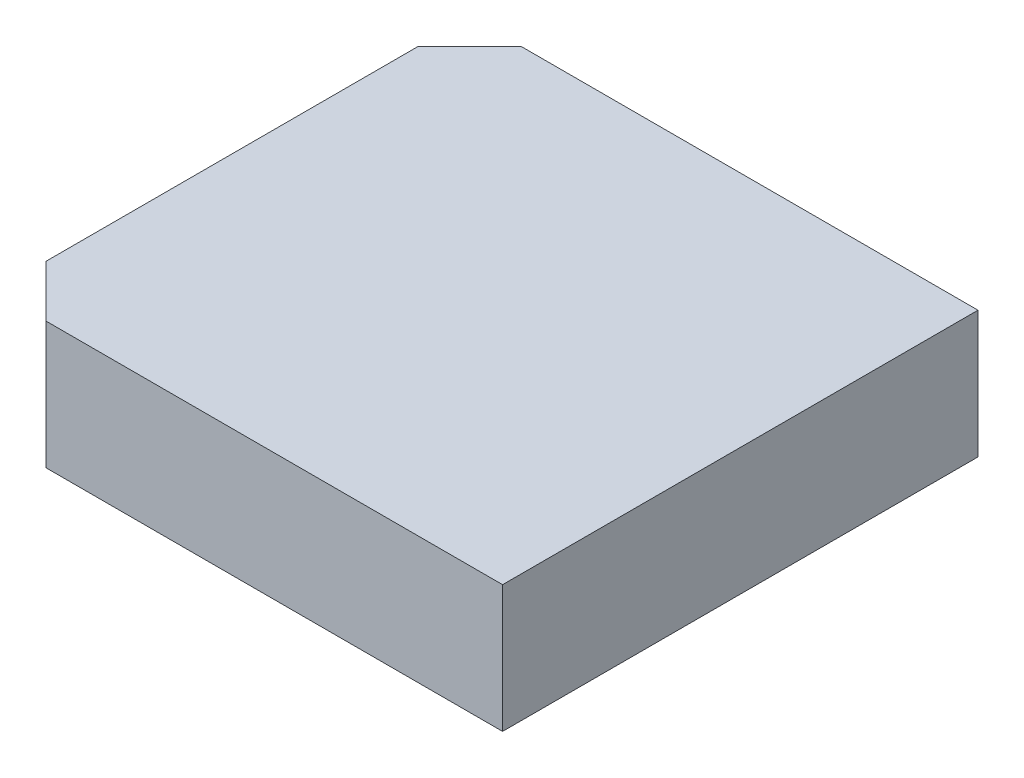
ISO-10303-21;
HEADER;
FILE_DESCRIPTION(('STEP AP214'),'2;1');
FILE_NAME('part.step','',(''),(''),'','','');
FILE_SCHEMA(('AUTOMOTIVE_DESIGN { 1 0 10303 214 1 1 1 1 }'));
ENDSEC;
DATA;
#1=APPLICATION_CONTEXT('core data for automotive mechanical design processes');
#2=APPLICATION_PROTOCOL_DEFINITION('international standard','automotive_design',2000,#1);
#3=PRODUCT_CONTEXT('',#1,'mechanical');
#4=PRODUCT('Part','Part','',(#3));
#5=PRODUCT_RELATED_PRODUCT_CATEGORY('part','',(#4));
#6=PRODUCT_DEFINITION_FORMATION('','',#4);
#7=PRODUCT_DEFINITION_CONTEXT('part definition',#1,'design');
#8=PRODUCT_DEFINITION('design','',#6,#7);
#9=PRODUCT_DEFINITION_SHAPE('','',#8);
#10=(LENGTH_UNIT() NAMED_UNIT(*) SI_UNIT(.MILLI.,.METRE.));
#11=(NAMED_UNIT(*) PLANE_ANGLE_UNIT() SI_UNIT($,.RADIAN.));
#12=(NAMED_UNIT(*) SI_UNIT($,.STERADIAN.) SOLID_ANGLE_UNIT());
#13=UNCERTAINTY_MEASURE_WITH_UNIT(LENGTH_MEASURE(1.E-05),#10,'distance_accuracy_value','');
#14=(GEOMETRIC_REPRESENTATION_CONTEXT(3) GLOBAL_UNCERTAINTY_ASSIGNED_CONTEXT((#13)) GLOBAL_UNIT_ASSIGNED_CONTEXT((#10,
#11,#12)) REPRESENTATION_CONTEXT('',''));
#15=CARTESIAN_POINT('',(0.,0.,0.));
#16=DIRECTION('',(0.,0.,1.));
#17=DIRECTION('',(1.,0.,0.));
#18=AXIS2_PLACEMENT_3D('',#15,#16,#17);
#19=CARTESIAN_POINT('',(4.77519999999999,2.032,-15.4178));
#20=DIRECTION('',(0.,1.,0.));
#21=DIRECTION('',(0.,0.,1.));
#22=AXIS2_PLACEMENT_3D('',#19,#20,#21);
#23=PLANE('',#22);
#24=DIRECTION('',(-1.,0.,0.));
#25=VECTOR('',#24,1.);
#26=CARTESIAN_POINT('',(-10.922,2.032,-12.827));
#27=LINE('',#26,#25);
#28=CARTESIAN_POINT('',(13.716,2.032,-12.827));
#29=VERTEX_POINT('',#28);
#30=CARTESIAN_POINT('',(-10.922,2.032,-12.827));
#31=VERTEX_POINT('',#30);
#32=EDGE_CURVE('E41',#29,#31,#27,.T.);
#33=ORIENTED_EDGE('',*,*,#32,.F.);
#34=DIRECTION('',(0.,0.,-1.));
#35=VECTOR('',#34,1.);
#36=CARTESIAN_POINT('',(13.716,2.032,-12.827));
#37=LINE('',#36,#35);
#38=CARTESIAN_POINT('',(13.716,2.032,12.827));
#39=VERTEX_POINT('',#38);
#40=EDGE_CURVE('E11',#39,#29,#37,.T.);
#41=ORIENTED_EDGE('',*,*,#40,.F.);
#42=DIRECTION('',(1.,0.,0.));
#43=VECTOR('',#42,1.);
#44=CARTESIAN_POINT('',(-13.717,2.032,12.827));
#45=LINE('',#44,#43);
#46=CARTESIAN_POINT('',(-10.922,2.032,12.827));
#47=VERTEX_POINT('',#46);
#48=EDGE_CURVE('E103',#47,#39,#45,.T.);
#49=ORIENTED_EDGE('',*,*,#48,.F.);
#50=DIRECTION('',(0.707106781186546,0.,0.707106781186549));
#51=VECTOR('',#50,1.);
#52=CARTESIAN_POINT('',(-13.716,2.032,10.033));
#53=LINE('',#52,#51);
#54=CARTESIAN_POINT('',(-13.716,2.032,10.033));
#55=VERTEX_POINT('',#54);
#56=EDGE_CURVE('E106',#55,#47,#53,.T.);
#57=ORIENTED_EDGE('',*,*,#56,.F.);
#58=DIRECTION('',(0.,0.,1.));
#59=VECTOR('',#58,1.);
#60=CARTESIAN_POINT('',(-13.716,2.032,-10.033));
#61=LINE('',#60,#59);
#62=CARTESIAN_POINT('',(-13.716,2.032,-10.033));
#63=VERTEX_POINT('',#62);
#64=EDGE_CURVE('E109',#63,#55,#61,.T.);
#65=ORIENTED_EDGE('',*,*,#64,.F.);
#66=DIRECTION('',(-0.707106781186551,0.,0.707106781186544));
#67=VECTOR('',#66,1.);
#68=CARTESIAN_POINT('',(-10.922,2.032,-12.827));
#69=LINE('',#68,#67);
#70=EDGE_CURVE('E36',#31,#63,#69,.T.);
#71=ORIENTED_EDGE('',*,*,#70,.F.);
#72=EDGE_LOOP('',(#33,#41,#49,#57,#65,#71));
#73=FACE_BOUND('',#72,.T.);
#74=ADVANCED_FACE('F33',(#73),#23,.F.);
#75=CARTESIAN_POINT('',(-13.716,8.89,-10.033));
#76=DIRECTION('',(1.,0.,0.));
#77=DIRECTION('',(0.,0.,-1.));
#78=AXIS2_PLACEMENT_3D('',#75,#76,#77);
#79=PLANE('',#78);
#80=DIRECTION('',(0.,-1.,0.));
#81=VECTOR('',#80,1.);
#82=CARTESIAN_POINT('',(-13.716,8.89,-10.033));
#83=LINE('',#82,#81);
#84=CARTESIAN_POINT('',(-13.716,8.89,-10.033));
#85=VERTEX_POINT('',#84);
#86=EDGE_CURVE('E125',#85,#63,#83,.T.);
#87=ORIENTED_EDGE('',*,*,#86,.T.);
#88=ORIENTED_EDGE('',*,*,#64,.T.);
#89=DIRECTION('',(0.,-1.,0.));
#90=VECTOR('',#89,1.);
#91=CARTESIAN_POINT('',(-13.716,8.89,10.033));
#92=LINE('',#91,#90);
#93=CARTESIAN_POINT('',(-13.716,8.89,10.033));
#94=VERTEX_POINT('',#93);
#95=EDGE_CURVE('E130',#94,#55,#92,.T.);
#96=ORIENTED_EDGE('',*,*,#95,.F.);
#97=DIRECTION('',(0.,0.,1.));
#98=VECTOR('',#97,1.);
#99=CARTESIAN_POINT('',(-13.716,8.89,-10.033));
#100=LINE('',#99,#98);
#101=EDGE_CURVE('E129',#85,#94,#100,.T.);
#102=ORIENTED_EDGE('',*,*,#101,.F.);
#103=EDGE_LOOP('',(#87,#88,#96,#102));
#104=FACE_BOUND('',#103,.T.);
#105=ADVANCED_FACE('F128',(#104),#79,.F.);
#106=CARTESIAN_POINT('',(7.366,8.89,-15.4178));
#107=DIRECTION('',(0.,1.,0.));
#108=DIRECTION('',(0.,0.,1.));
#109=AXIS2_PLACEMENT_3D('',#106,#107,#108);
#110=PLANE('',#109);
#111=DIRECTION('',(-1.,0.,0.));
#112=VECTOR('',#111,1.);
#113=CARTESIAN_POINT('',(7.36599999999999,8.89,-12.827));
#114=LINE('',#113,#112);
#115=CARTESIAN_POINT('',(13.716,8.89,-12.827));
#116=VERTEX_POINT('',#115);
#117=CARTESIAN_POINT('',(-10.922,8.89,-12.827));
#118=VERTEX_POINT('',#117);
#119=EDGE_CURVE('E93',#116,#118,#114,.T.);
#120=ORIENTED_EDGE('',*,*,#119,.T.);
#121=DIRECTION('',(-0.707106781186551,0.,0.707106781186544));
#122=VECTOR('',#121,1.);
#123=CARTESIAN_POINT('',(-10.922,8.89,-12.827));
#124=LINE('',#123,#122);
#125=EDGE_CURVE('E138',#118,#85,#124,.T.);
#126=ORIENTED_EDGE('',*,*,#125,.T.);
#127=ORIENTED_EDGE('',*,*,#101,.T.);
#128=DIRECTION('',(0.707106781186546,0.,0.707106781186549));
#129=VECTOR('',#128,1.);
#130=CARTESIAN_POINT('',(-13.716,8.89,10.033));
#131=LINE('',#130,#129);
#132=CARTESIAN_POINT('',(-10.922,8.89,12.827));
#133=VERTEX_POINT('',#132);
#134=EDGE_CURVE('E99',#94,#133,#131,.T.);
#135=ORIENTED_EDGE('',*,*,#134,.T.);
#136=DIRECTION('',(1.,0.,0.));
#137=VECTOR('',#136,1.);
#138=CARTESIAN_POINT('',(7.36599999999999,8.89,12.827));
#139=LINE('',#138,#137);
#140=CARTESIAN_POINT('',(13.716,8.89,12.827));
#141=VERTEX_POINT('',#140);
#142=EDGE_CURVE('E94',#133,#141,#139,.T.);
#143=ORIENTED_EDGE('',*,*,#142,.T.);
#144=DIRECTION('',(0.,0.,-1.));
#145=VECTOR('',#144,1.);
#146=CARTESIAN_POINT('',(13.716,8.89,-12.827));
#147=LINE('',#146,#145);
#148=EDGE_CURVE('E85',#141,#116,#147,.T.);
#149=ORIENTED_EDGE('',*,*,#148,.T.);
#150=EDGE_LOOP('',(#120,#126,#127,#135,#143,#149));
#151=FACE_BOUND('',#150,.T.);
#152=ADVANCED_FACE('F97',(#151),#110,.T.);
#153=CARTESIAN_POINT('',(-10.922,8.89,-12.827));
#154=DIRECTION('',(0.707106781186544,0.,0.707106781186551));
#155=DIRECTION('',(0.707106781186551,0.,-0.707106781186544));
#156=AXIS2_PLACEMENT_3D('',#153,#154,#155);
#157=PLANE('',#156);
#158=DIRECTION('',(0.,-1.,0.));
#159=VECTOR('',#158,1.);
#160=CARTESIAN_POINT('',(-10.922,8.89,-12.827));
#161=LINE('',#160,#159);
#162=EDGE_CURVE('E111',#118,#31,#161,.T.);
#163=ORIENTED_EDGE('',*,*,#162,.T.);
#164=ORIENTED_EDGE('',*,*,#70,.T.);
#165=ORIENTED_EDGE('',*,*,#86,.F.);
#166=ORIENTED_EDGE('',*,*,#125,.F.);
#167=EDGE_LOOP('',(#163,#164,#165,#166));
#168=FACE_BOUND('',#167,.T.);
#169=ADVANCED_FACE('F123',(#168),#157,.F.);
#170=CARTESIAN_POINT('',(13.716,8.89,-12.827));
#171=DIRECTION('',(-1.,0.,0.));
#172=DIRECTION('',(0.,0.,1.));
#173=AXIS2_PLACEMENT_3D('',#170,#171,#172);
#174=PLANE('',#173);
#175=DIRECTION('',(0.,-1.,0.));
#176=VECTOR('',#175,1.);
#177=CARTESIAN_POINT('',(13.716,8.89,12.827));
#178=LINE('',#177,#176);
#179=EDGE_CURVE('E89',#141,#39,#178,.T.);
#180=ORIENTED_EDGE('',*,*,#179,.T.);
#181=ORIENTED_EDGE('',*,*,#40,.T.);
#182=DIRECTION('',(0.,-1.,0.));
#183=VECTOR('',#182,1.);
#184=CARTESIAN_POINT('',(13.716,8.89,-12.827));
#185=LINE('',#184,#183);
#186=EDGE_CURVE('E90',#116,#29,#185,.T.);
#187=ORIENTED_EDGE('',*,*,#186,.F.);
#188=ORIENTED_EDGE('',*,*,#148,.F.);
#189=EDGE_LOOP('',(#180,#181,#187,#188));
#190=FACE_BOUND('',#189,.T.);
#191=ADVANCED_FACE('F87',(#190),#174,.F.);
#192=CARTESIAN_POINT('',(-10.922,8.89,-12.827));
#193=DIRECTION('',(0.,0.,1.));
#194=DIRECTION('',(1.,0.,0.));
#195=AXIS2_PLACEMENT_3D('',#192,#193,#194);
#196=PLANE('',#195);
#197=ORIENTED_EDGE('',*,*,#186,.T.);
#198=ORIENTED_EDGE('',*,*,#32,.T.);
#199=ORIENTED_EDGE('',*,*,#162,.F.);
#200=ORIENTED_EDGE('',*,*,#119,.F.);
#201=EDGE_LOOP('',(#197,#198,#199,#200));
#202=FACE_BOUND('',#201,.T.);
#203=ADVANCED_FACE('F141',(#202),#196,.F.);
#204=CARTESIAN_POINT('',(-13.716,8.89,10.033));
#205=DIRECTION('',(0.707106781186549,0.,-0.707106781186546));
#206=DIRECTION('',(-0.707106781186546,0.,-0.707106781186549));
#207=AXIS2_PLACEMENT_3D('',#204,#205,#206);
#208=PLANE('',#207);
#209=ORIENTED_EDGE('',*,*,#95,.T.);
#210=ORIENTED_EDGE('',*,*,#56,.T.);
#211=DIRECTION('',(0.,-1.,0.));
#212=VECTOR('',#211,1.);
#213=CARTESIAN_POINT('',(-10.922,8.89,12.827));
#214=LINE('',#213,#212);
#215=EDGE_CURVE('E132',#133,#47,#214,.T.);
#216=ORIENTED_EDGE('',*,*,#215,.F.);
#217=ORIENTED_EDGE('',*,*,#134,.F.);
#218=EDGE_LOOP('',(#209,#210,#216,#217));
#219=FACE_BOUND('',#218,.T.);
#220=ADVANCED_FACE('F143',(#219),#208,.F.);
#221=CARTESIAN_POINT('',(-10.922,8.89,12.827));
#222=DIRECTION('',(0.,0.,-1.));
#223=DIRECTION('',(-1.,0.,0.));
#224=AXIS2_PLACEMENT_3D('',#221,#222,#223);
#225=PLANE('',#224);
#226=ORIENTED_EDGE('',*,*,#215,.T.);
#227=ORIENTED_EDGE('',*,*,#48,.T.);
#228=ORIENTED_EDGE('',*,*,#179,.F.);
#229=ORIENTED_EDGE('',*,*,#142,.F.);
#230=EDGE_LOOP('',(#226,#227,#228,#229));
#231=FACE_BOUND('',#230,.T.);
#232=ADVANCED_FACE('F105',(#231),#225,.F.);
#233=CLOSED_SHELL('',(#74,#105,#152,#169,#191,#203,#220,#232));
#234=MANIFOLD_SOLID_BREP('B2',#233);
#235=ADVANCED_BREP_SHAPE_REPRESENTATION('',(#18,#234),#14);
#236=SHAPE_DEFINITION_REPRESENTATION(#9,#235);
ENDSEC;
END-ISO-10303-21;
